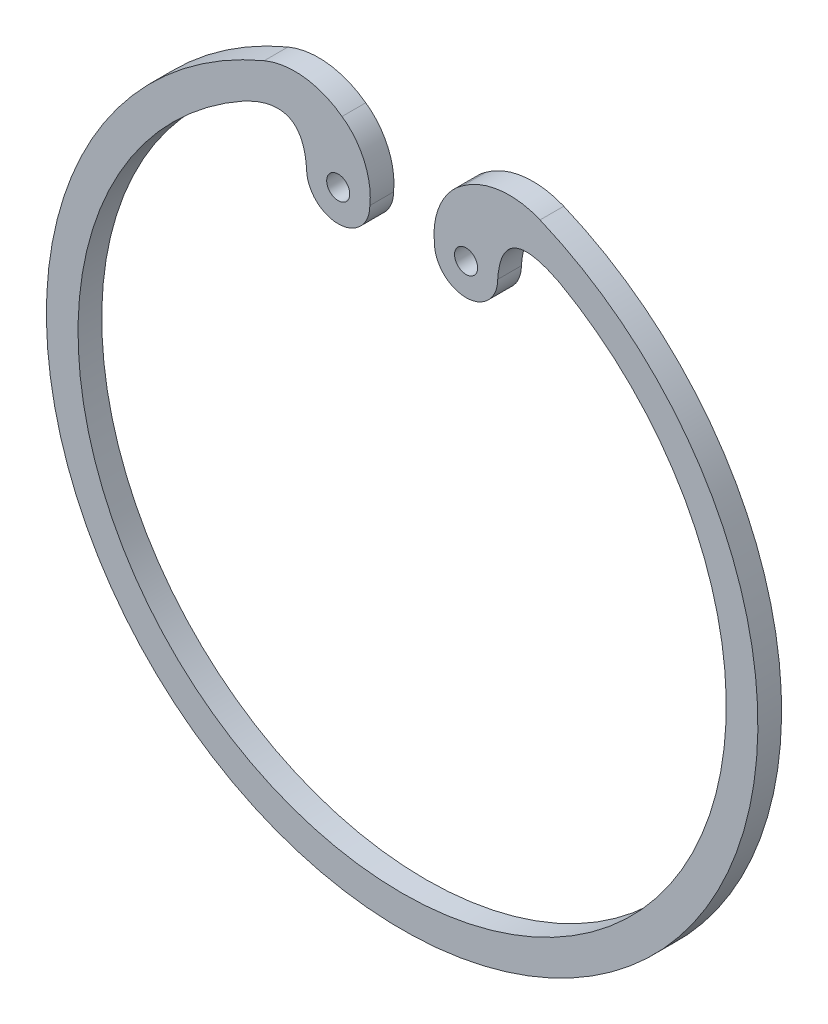
ISO-10303-21;
HEADER;
FILE_DESCRIPTION(('STEP AP214'),'2;1');
FILE_NAME('part.step','',(''),(''),'','','');
FILE_SCHEMA(('AUTOMOTIVE_DESIGN { 1 0 10303 214 1 1 1 1 }'));
ENDSEC;
DATA;
#1=APPLICATION_CONTEXT('core data for automotive mechanical design processes');
#2=APPLICATION_PROTOCOL_DEFINITION('international standard','automotive_design',2000,#1);
#3=PRODUCT_CONTEXT('',#1,'mechanical');
#4=PRODUCT('Part','Part','',(#3));
#5=PRODUCT_RELATED_PRODUCT_CATEGORY('part','',(#4));
#6=PRODUCT_DEFINITION_FORMATION('','',#4);
#7=PRODUCT_DEFINITION_CONTEXT('part definition',#1,'design');
#8=PRODUCT_DEFINITION('design','',#6,#7);
#9=PRODUCT_DEFINITION_SHAPE('','',#8);
#10=(LENGTH_UNIT() NAMED_UNIT(*) SI_UNIT(.MILLI.,.METRE.));
#11=(NAMED_UNIT(*) PLANE_ANGLE_UNIT() SI_UNIT($,.RADIAN.));
#12=(NAMED_UNIT(*) SI_UNIT($,.STERADIAN.) SOLID_ANGLE_UNIT());
#13=UNCERTAINTY_MEASURE_WITH_UNIT(LENGTH_MEASURE(1.E-05),#10,'distance_accuracy_value','');
#14=(GEOMETRIC_REPRESENTATION_CONTEXT(3) GLOBAL_UNCERTAINTY_ASSIGNED_CONTEXT((#13)) GLOBAL_UNIT_ASSIGNED_CONTEXT((#10,
#11,#12)) REPRESENTATION_CONTEXT('',''));
#15=CARTESIAN_POINT('',(0.,0.,0.));
#16=DIRECTION('',(0.,0.,1.));
#17=DIRECTION('',(1.,0.,0.));
#18=AXIS2_PLACEMENT_3D('',#15,#16,#17);
#19=CARTESIAN_POINT('',(0.,0.,3.));
#20=DIRECTION('',(0.,0.,1.));
#21=DIRECTION('',(1.,0.,0.));
#22=AXIS2_PLACEMENT_3D('',#19,#20,#21);
#23=PLANE('',#22);
#24=CARTESIAN_POINT('',(8.08641677086364,32.2850390508751,3.));
#25=DIRECTION('',(0.,0.,-1.));
#26=DIRECTION('',(-1.,0.,0.));
#27=AXIS2_PLACEMENT_3D('',#24,#25,#26);
#28=CIRCLE('',#27,1.45979372468937);
#29=CARTESIAN_POINT('',(6.62662304617427,32.2850390508751,3.));
#30=VERTEX_POINT('',#29);
#31=EDGE_CURVE('E346',#30,#30,#28,.T.);
#32=ORIENTED_EDGE('',*,*,#31,.T.);
#33=EDGE_LOOP('',(#32));
#34=FACE_BOUND('',#33,.T.);
#35=CARTESIAN_POINT('',(-8.08641677086364,32.2850390508751,3.));
#36=DIRECTION('',(0.,0.,1.));
#37=DIRECTION('',(1.,0.,0.));
#38=AXIS2_PLACEMENT_3D('',#35,#36,#37);
#39=CIRCLE('',#38,1.45979372468937);
#40=CARTESIAN_POINT('',(-6.62662304617427,32.2850390508751,3.));
#41=VERTEX_POINT('',#40);
#42=EDGE_CURVE('E221',#41,#41,#39,.T.);
#43=ORIENTED_EDGE('',*,*,#42,.F.);
#44=EDGE_LOOP('',(#43));
#45=FACE_BOUND('',#44,.T.);
#46=CARTESIAN_POINT('',(0.,0.,3.));
#47=DIRECTION('',(0.,0.,1.));
#48=DIRECTION('',(1.,0.,0.));
#49=AXIS2_PLACEMENT_3D('',#46,#47,#48);
#50=CIRCLE('',#49,45.);
#51=CARTESIAN_POINT('',(-17.4448135891502,41.4810616889179,3.));
#52=VERTEX_POINT('',#51);
#53=CARTESIAN_POINT('',(17.4448135891502,41.4810616889179,3.));
#54=VERTEX_POINT('',#53);
#55=EDGE_CURVE('E126',#52,#54,#50,.T.);
#56=ORIENTED_EDGE('',*,*,#55,.T.);
#57=CARTESIAN_POINT('',(13.5681883471168,32.2630479802695,3.));
#58=DIRECTION('',(0.,0.,1.));
#59=DIRECTION('',(1.,0.,0.));
#60=AXIS2_PLACEMENT_3D('',#57,#58,#59);
#61=CIRCLE('',#60,10.);
#62=CARTESIAN_POINT('',(7.60283683229724,40.2889174848551,3.));
#63=VERTEX_POINT('',#62);
#64=EDGE_CURVE('E54',#54,#63,#61,.T.);
#65=ORIENTED_EDGE('',*,*,#64,.T.);
#66=CARTESIAN_POINT('',(4.08641677086364,32.2850390508751,3.));
#67=CARTESIAN_POINT('',(3.77552911303632,34.9284671060197,3.));
#68=CARTESIAN_POINT('',(6.01321851688633,41.2063491480814,3.));
#69=CARTESIAN_POINT('',(12.6869936092536,42.3833529375417,3.));
#70=CARTESIAN_POINT('',(15.6688862679907,42.1839543324327,3.));
#71=B_SPLINE_CURVE_WITH_KNOTS('',3,(#66,#67,#68,#69,#70),.UNSPECIFIED.,.F.,.F.,(4,1,4),(0.,
0.461232636080991,1.),.UNSPECIFIED.);
#72=CARTESIAN_POINT('',(4.08641677086363,32.2850390508751,3.));
#73=VERTEX_POINT('',#72);
#74=EDGE_CURVE('E124',#73,#63,#71,.T.);
#75=ORIENTED_EDGE('',*,*,#74,.F.);
#76=CARTESIAN_POINT('',(8.08641677086364,32.2850390508751,3.));
#77=DIRECTION('',(0.,0.,-1.));
#78=DIRECTION('',(-1.,0.,0.));
#79=AXIS2_PLACEMENT_3D('',#76,#77,#78);
#80=CIRCLE('',#79,4.);
#81=CARTESIAN_POINT('',(12.0864167708636,32.2850390508751,3.));
#82=VERTEX_POINT('',#81);
#83=EDGE_CURVE('E135',#82,#73,#80,.T.);
#84=ORIENTED_EDGE('',*,*,#83,.F.);
#85=CARTESIAN_POINT('',(19.8836619065728,35.8558222494634,3.));
#86=CARTESIAN_POINT('',(12.5978527141027,39.5892887875731,3.));
#87=CARTESIAN_POINT('',(12.0864167708636,32.2850390508751,3.));
#88=B_SPLINE_CURVE_WITH_KNOTS('',2,(#85,#86,#87),.UNSPECIFIED.,.F.,.F.,(3,3),(0.,1.),.UNSPECIFIED.);
#89=CARTESIAN_POINT('',(19.8836619065728,35.8558222494634,3.));
#90=VERTEX_POINT('',#89);
#91=EDGE_CURVE('E136',#90,#82,#88,.T.);
#92=ORIENTED_EDGE('',*,*,#91,.F.);
#93=CARTESIAN_POINT('',(0.,0.,3.));
#94=DIRECTION('',(0.,0.,1.));
#95=DIRECTION('',(1.,0.,0.));
#96=AXIS2_PLACEMENT_3D('',#93,#94,#95);
#97=CIRCLE('',#96,41.);
#98=CARTESIAN_POINT('',(-19.8836619065728,35.8558222494634,3.));
#99=VERTEX_POINT('',#98);
#100=EDGE_CURVE('E152',#99,#90,#97,.T.);
#101=ORIENTED_EDGE('',*,*,#100,.F.);
#102=CARTESIAN_POINT('',(-19.8836619065728,35.8558222494634,3.));
#103=CARTESIAN_POINT('',(-12.5978527141027,39.5892887875731,3.));
#104=CARTESIAN_POINT('',(-12.0864167708636,32.2850390508751,3.));
#105=B_SPLINE_CURVE_WITH_KNOTS('',2,(#102,#103,#104),.UNSPECIFIED.,.F.,.F.,(3,3),(0.,1.),.UNSPECIFIED.);
#106=CARTESIAN_POINT('',(-12.0864167708636,32.2850390508751,3.));
#107=VERTEX_POINT('',#106);
#108=EDGE_CURVE('E179',#99,#107,#105,.T.);
#109=ORIENTED_EDGE('',*,*,#108,.T.);
#110=CARTESIAN_POINT('',(-8.08641677086364,32.2850390508751,3.));
#111=DIRECTION('',(0.,0.,1.));
#112=DIRECTION('',(1.,0.,0.));
#113=AXIS2_PLACEMENT_3D('',#110,#111,#112);
#114=CIRCLE('',#113,4.);
#115=CARTESIAN_POINT('',(-4.08641677086363,32.2850390508751,3.));
#116=VERTEX_POINT('',#115);
#117=EDGE_CURVE('E173',#107,#116,#114,.T.);
#118=ORIENTED_EDGE('',*,*,#117,.T.);
#119=CARTESIAN_POINT('',(-4.08641677086364,32.2850390508751,3.));
#120=CARTESIAN_POINT('',(-3.77552911303632,34.9284671060197,3.));
#121=CARTESIAN_POINT('',(-6.01321851688633,41.2063491480814,3.));
#122=CARTESIAN_POINT('',(-12.6869936092536,42.3833529375417,3.));
#123=CARTESIAN_POINT('',(-15.6688862679907,42.1839543324327,3.));
#124=B_SPLINE_CURVE_WITH_KNOTS('',3,(#119,#120,#121,#122,#123),.UNSPECIFIED.,.F.,.F.,(4,1,4),
(0.,0.461232636080991,1.),.UNSPECIFIED.);
#125=CARTESIAN_POINT('',(-7.60283683229725,40.2889174848551,3.));
#126=VERTEX_POINT('',#125);
#127=EDGE_CURVE('E167',#116,#126,#124,.T.);
#128=ORIENTED_EDGE('',*,*,#127,.T.);
#129=CARTESIAN_POINT('',(-13.5681883471168,32.2630479802695,3.));
#130=DIRECTION('',(0.,0.,1.));
#131=DIRECTION('',(1.,0.,0.));
#132=AXIS2_PLACEMENT_3D('',#129,#130,#131);
#133=CIRCLE('',#132,10.);
#134=EDGE_CURVE('E145',#126,#52,#133,.T.);
#135=ORIENTED_EDGE('',*,*,#134,.T.);
#136=EDGE_LOOP('',(#56,#65,#75,#84,#92,#101,#109,#118,#128,#135));
#137=FACE_BOUND('',#136,.T.);
#138=ADVANCED_FACE('F46',(#34,#45,#137),#23,.T.);
#139=CARTESIAN_POINT('',(0.,0.,0.));
#140=DIRECTION('',(0.,0.,1.));
#141=DIRECTION('',(1.,0.,0.));
#142=AXIS2_PLACEMENT_3D('',#139,#140,#141);
#143=PLANE('',#142);
#144=CARTESIAN_POINT('',(-8.08641677086364,32.2850390508751,0.));
#145=DIRECTION('',(0.,0.,1.));
#146=DIRECTION('',(1.,0.,0.));
#147=AXIS2_PLACEMENT_3D('',#144,#145,#146);
#148=CIRCLE('',#147,1.45979372468937);
#149=CARTESIAN_POINT('',(-6.62662304617427,32.2850390508751,0.));
#150=VERTEX_POINT('',#149);
#151=EDGE_CURVE('E184',#150,#150,#148,.T.);
#152=ORIENTED_EDGE('',*,*,#151,.T.);
#153=EDGE_LOOP('',(#152));
#154=FACE_BOUND('',#153,.T.);
#155=CARTESIAN_POINT('',(8.08641677086364,32.2850390508751,0.));
#156=DIRECTION('',(0.,0.,-1.));
#157=DIRECTION('',(-1.,0.,0.));
#158=AXIS2_PLACEMENT_3D('',#155,#156,#157);
#159=CIRCLE('',#158,1.45979372468937);
#160=CARTESIAN_POINT('',(6.62662304617427,32.2850390508751,0.));
#161=VERTEX_POINT('',#160);
#162=EDGE_CURVE('E247',#161,#161,#159,.T.);
#163=ORIENTED_EDGE('',*,*,#162,.F.);
#164=EDGE_LOOP('',(#163));
#165=FACE_BOUND('',#164,.T.);
#166=CARTESIAN_POINT('',(4.08641677086364,32.2850390508751,0.));
#167=CARTESIAN_POINT('',(3.77552911303632,34.9284671060197,0.));
#168=CARTESIAN_POINT('',(6.01321851688633,41.2063491480814,0.));
#169=CARTESIAN_POINT('',(12.6869936092536,42.3833529375417,0.));
#170=CARTESIAN_POINT('',(15.6688862679907,42.1839543324327,0.));
#171=B_SPLINE_CURVE_WITH_KNOTS('',3,(#166,#167,#168,#169,#170),.UNSPECIFIED.,.F.,.F.,(4,1,4),
(0.,0.461232636080991,1.),.UNSPECIFIED.);
#172=CARTESIAN_POINT('',(4.08641677086363,32.2850390508751,0.));
#173=VERTEX_POINT('',#172);
#174=CARTESIAN_POINT('',(7.60283683229759,40.2889174848553,0.));
#175=VERTEX_POINT('',#174);
#176=EDGE_CURVE('E252',#173,#175,#171,.T.);
#177=ORIENTED_EDGE('',*,*,#176,.T.);
#178=CARTESIAN_POINT('',(13.5681883471168,32.2630479802695,0.));
#179=DIRECTION('',(0.,0.,1.));
#180=DIRECTION('',(1.,0.,0.));
#181=AXIS2_PLACEMENT_3D('',#178,#179,#180);
#182=CIRCLE('',#181,10.);
#183=CARTESIAN_POINT('',(17.4448135891502,41.4810616889179,0.));
#184=VERTEX_POINT('',#183);
#185=EDGE_CURVE('E13',#175,#184,#182,.F.);
#186=ORIENTED_EDGE('',*,*,#185,.T.);
#187=CARTESIAN_POINT('',(0.,0.,0.));
#188=DIRECTION('',(0.,0.,1.));
#189=DIRECTION('',(1.,0.,0.));
#190=AXIS2_PLACEMENT_3D('',#187,#188,#189);
#191=CIRCLE('',#190,45.);
#192=CARTESIAN_POINT('',(-17.4448135891502,41.4810616889179,0.));
#193=VERTEX_POINT('',#192);
#194=EDGE_CURVE('E150',#193,#184,#191,.T.);
#195=ORIENTED_EDGE('',*,*,#194,.F.);
#196=CARTESIAN_POINT('',(-13.5681883471168,32.2630479802695,0.));
#197=DIRECTION('',(0.,0.,1.));
#198=DIRECTION('',(1.,0.,0.));
#199=AXIS2_PLACEMENT_3D('',#196,#197,#198);
#200=CIRCLE('',#199,10.);
#201=CARTESIAN_POINT('',(-7.60283683229724,40.2889174848551,0.));
#202=VERTEX_POINT('',#201);
#203=EDGE_CURVE('E138',#193,#202,#200,.F.);
#204=ORIENTED_EDGE('',*,*,#203,.T.);
#205=CARTESIAN_POINT('',(-4.08641677086364,32.2850390508751,0.));
#206=CARTESIAN_POINT('',(-3.77552911303632,34.9284671060197,0.));
#207=CARTESIAN_POINT('',(-6.01321851688633,41.2063491480814,0.));
#208=CARTESIAN_POINT('',(-12.6869936092536,42.3833529375417,0.));
#209=CARTESIAN_POINT('',(-15.6688862679907,42.1839543324327,0.));
#210=B_SPLINE_CURVE_WITH_KNOTS('',3,(#205,#206,#207,#208,#209),.UNSPECIFIED.,.F.,.F.,(4,1,4),
(0.,0.461232636080991,1.),.UNSPECIFIED.);
#211=CARTESIAN_POINT('',(-4.08641677086363,32.2850390508751,0.));
#212=VERTEX_POINT('',#211);
#213=EDGE_CURVE('E163',#212,#202,#210,.T.);
#214=ORIENTED_EDGE('',*,*,#213,.F.);
#215=CARTESIAN_POINT('',(-8.08641677086364,32.2850390508751,0.));
#216=DIRECTION('',(0.,0.,1.));
#217=DIRECTION('',(1.,0.,0.));
#218=AXIS2_PLACEMENT_3D('',#215,#216,#217);
#219=CIRCLE('',#218,4.);
#220=CARTESIAN_POINT('',(-12.0864167708636,32.2850390508751,0.));
#221=VERTEX_POINT('',#220);
#222=EDGE_CURVE('E193',#221,#212,#219,.T.);
#223=ORIENTED_EDGE('',*,*,#222,.F.);
#224=CARTESIAN_POINT('',(-19.8836619065728,35.8558222494634,0.));
#225=CARTESIAN_POINT('',(-12.5978527141027,39.5892887875731,0.));
#226=CARTESIAN_POINT('',(-12.0864167708636,32.2850390508751,0.));
#227=B_SPLINE_CURVE_WITH_KNOTS('',2,(#224,#225,#226),.UNSPECIFIED.,.F.,.F.,(3,3),(0.,1.),.UNSPECIFIED.);
#228=CARTESIAN_POINT('',(-19.8836619065728,35.8558222494634,0.));
#229=VERTEX_POINT('',#228);
#230=EDGE_CURVE('E172',#229,#221,#227,.T.);
#231=ORIENTED_EDGE('',*,*,#230,.F.);
#232=CARTESIAN_POINT('',(0.,0.,0.));
#233=DIRECTION('',(0.,0.,1.));
#234=DIRECTION('',(1.,0.,0.));
#235=AXIS2_PLACEMENT_3D('',#232,#233,#234);
#236=CIRCLE('',#235,41.);
#237=CARTESIAN_POINT('',(19.8836619065728,35.8558222494634,0.));
#238=VERTEX_POINT('',#237);
#239=EDGE_CURVE('E154',#229,#238,#236,.T.);
#240=ORIENTED_EDGE('',*,*,#239,.T.);
#241=CARTESIAN_POINT('',(19.8836619065728,35.8558222494634,0.));
#242=CARTESIAN_POINT('',(12.5978527141027,39.5892887875731,0.));
#243=CARTESIAN_POINT('',(12.0864167708636,32.2850390508751,0.));
#244=B_SPLINE_CURVE_WITH_KNOTS('',2,(#241,#242,#243),.UNSPECIFIED.,.F.,.F.,(3,3),(0.,1.),.UNSPECIFIED.);
#245=CARTESIAN_POINT('',(12.0864167708636,32.2850390508751,0.));
#246=VERTEX_POINT('',#245);
#247=EDGE_CURVE('E236',#238,#246,#244,.T.);
#248=ORIENTED_EDGE('',*,*,#247,.T.);
#249=CARTESIAN_POINT('',(8.08641677086364,32.2850390508751,0.));
#250=DIRECTION('',(0.,0.,-1.));
#251=DIRECTION('',(-1.,0.,0.));
#252=AXIS2_PLACEMENT_3D('',#249,#250,#251);
#253=CIRCLE('',#252,4.);
#254=EDGE_CURVE('E232',#246,#173,#253,.T.);
#255=ORIENTED_EDGE('',*,*,#254,.T.);
#256=EDGE_LOOP('',(#177,#186,#195,#204,#214,#223,#231,#240,#248,#255));
#257=FACE_BOUND('',#256,.T.);
#258=ADVANCED_FACE('F281',(#154,#165,#257),#143,.F.);
#259=CARTESIAN_POINT('',(0.,0.,3.));
#260=DIRECTION('',(0.,0.,-1.));
#261=DIRECTION('',(-1.,0.,0.));
#262=AXIS2_PLACEMENT_3D('',#259,#260,#261);
#263=CYLINDRICAL_SURFACE('',#262,45.);
#264=ORIENTED_EDGE('',*,*,#194,.T.);
#265=DIRECTION('',(0.,0.,-1.));
#266=VECTOR('',#265,1.);
#267=CARTESIAN_POINT('',(17.4448135891502,41.4810616889179,3.));
#268=LINE('',#267,#266);
#269=EDGE_CURVE('E127',#184,#54,#268,.F.);
#270=ORIENTED_EDGE('',*,*,#269,.T.);
#271=ORIENTED_EDGE('',*,*,#55,.F.);
#272=DIRECTION('',(0.,0.,-1.));
#273=VECTOR('',#272,1.);
#274=CARTESIAN_POINT('',(-17.4448135891502,41.4810616889179,3.));
#275=LINE('',#274,#273);
#276=EDGE_CURVE('E141',#52,#193,#275,.T.);
#277=ORIENTED_EDGE('',*,*,#276,.T.);
#278=EDGE_LOOP('',(#264,#270,#271,#277));
#279=FACE_BOUND('',#278,.T.);
#280=ADVANCED_FACE('F286',(#279),#263,.T.);
#281=CARTESIAN_POINT('',(0.,0.,3.));
#282=DIRECTION('',(0.,0.,-1.));
#283=DIRECTION('',(-1.,0.,0.));
#284=AXIS2_PLACEMENT_3D('',#281,#282,#283);
#285=CYLINDRICAL_SURFACE('',#284,41.);
#286=ORIENTED_EDGE('',*,*,#100,.T.);
#287=DIRECTION('',(0.,0.,1.));
#288=VECTOR('',#287,1.);
#289=CARTESIAN_POINT('',(19.8836619065728,35.8558222494634,0.));
#290=LINE('',#289,#288);
#291=EDGE_CURVE('E230',#238,#90,#290,.T.);
#292=ORIENTED_EDGE('',*,*,#291,.F.);
#293=ORIENTED_EDGE('',*,*,#239,.F.);
#294=DIRECTION('',(0.,0.,1.));
#295=VECTOR('',#294,1.);
#296=CARTESIAN_POINT('',(-19.8836619065728,35.8558222494634,0.));
#297=LINE('',#296,#295);
#298=EDGE_CURVE('E157',#229,#99,#297,.T.);
#299=ORIENTED_EDGE('',*,*,#298,.T.);
#300=EDGE_LOOP('',(#286,#292,#293,#299));
#301=FACE_BOUND('',#300,.T.);
#302=ADVANCED_FACE('F213',(#301),#285,.F.);
#303=DIRECTION('',(0.,0.,1.));
#304=VECTOR('',#303,1.);
#305=SURFACE_OF_LINEAR_EXTRUSION('',#227,#304);
#306=ORIENTED_EDGE('',*,*,#108,.F.);
#307=ORIENTED_EDGE('',*,*,#298,.F.);
#308=ORIENTED_EDGE('',*,*,#230,.T.);
#309=DIRECTION('',(0.,0.,1.));
#310=VECTOR('',#309,1.);
#311=CARTESIAN_POINT('',(-12.0864167708636,32.2850390508751,0.));
#312=LINE('',#311,#310);
#313=EDGE_CURVE('E160',#221,#107,#312,.T.);
#314=ORIENTED_EDGE('',*,*,#313,.T.);
#315=EDGE_LOOP('',(#306,#307,#308,#314));
#316=FACE_BOUND('',#315,.T.);
#317=ADVANCED_FACE('F204',(#316),#305,.T.);
#318=DIRECTION('',(0.,0.,1.));
#319=VECTOR('',#318,1.);
#320=SURFACE_OF_LINEAR_EXTRUSION('',#210,#319);
#321=ORIENTED_EDGE('',*,*,#213,.T.);
#322=DIRECTION('',(0.,0.,1.));
#323=VECTOR('',#322,1.);
#324=CARTESIAN_POINT('',(-7.60283683229726,40.2889174848551,0.));
#325=LINE('',#324,#323);
#326=EDGE_CURVE('E147',#202,#126,#325,.T.);
#327=ORIENTED_EDGE('',*,*,#326,.T.);
#328=ORIENTED_EDGE('',*,*,#127,.F.);
#329=DIRECTION('',(0.,0.,1.));
#330=VECTOR('',#329,1.);
#331=CARTESIAN_POINT('',(-4.08641677086363,32.2850390508751,0.));
#332=LINE('',#331,#330);
#333=EDGE_CURVE('E162',#212,#116,#332,.T.);
#334=ORIENTED_EDGE('',*,*,#333,.F.);
#335=EDGE_LOOP('',(#321,#327,#328,#334));
#336=FACE_BOUND('',#335,.T.);
#337=ADVANCED_FACE('F199',(#336),#320,.T.);
#338=CARTESIAN_POINT('',(-8.08641677086364,32.2850390508751,0.));
#339=DIRECTION('',(0.,0.,1.));
#340=DIRECTION('',(1.,0.,0.));
#341=AXIS2_PLACEMENT_3D('',#338,#339,#340);
#342=CYLINDRICAL_SURFACE('',#341,4.);
#343=ORIENTED_EDGE('',*,*,#117,.F.);
#344=ORIENTED_EDGE('',*,*,#313,.F.);
#345=ORIENTED_EDGE('',*,*,#222,.T.);
#346=ORIENTED_EDGE('',*,*,#333,.T.);
#347=EDGE_LOOP('',(#343,#344,#345,#346));
#348=FACE_BOUND('',#347,.T.);
#349=ADVANCED_FACE('F203',(#348),#342,.T.);
#350=CARTESIAN_POINT('',(-8.08641677086364,32.2850390508751,0.));
#351=DIRECTION('',(0.,0.,1.));
#352=DIRECTION('',(1.,0.,0.));
#353=AXIS2_PLACEMENT_3D('',#350,#351,#352);
#354=CYLINDRICAL_SURFACE('',#353,1.45979372468937);
#355=ORIENTED_EDGE('',*,*,#151,.F.);
#356=EDGE_LOOP('',(#355));
#357=FACE_BOUND('',#356,.T.);
#358=ORIENTED_EDGE('',*,*,#42,.T.);
#359=EDGE_LOOP('',(#358));
#360=FACE_BOUND('',#359,.T.);
#361=ADVANCED_FACE('F206',(#357,#360),#354,.F.);
#362=CARTESIAN_POINT('',(-13.5681883471168,32.2630479802695,3.));
#363=DIRECTION('',(0.,0.,-1.));
#364=DIRECTION('',(-1.,0.,0.));
#365=AXIS2_PLACEMENT_3D('',#362,#363,#364);
#366=CYLINDRICAL_SURFACE('',#365,10.);
#367=ORIENTED_EDGE('',*,*,#203,.F.);
#368=ORIENTED_EDGE('',*,*,#276,.F.);
#369=ORIENTED_EDGE('',*,*,#134,.F.);
#370=ORIENTED_EDGE('',*,*,#326,.F.);
#371=EDGE_LOOP('',(#367,#368,#369,#370));
#372=FACE_BOUND('',#371,.T.);
#373=ADVANCED_FACE('F272',(#372),#366,.T.);
#374=DIRECTION('',(0.,0.,1.));
#375=VECTOR('',#374,1.);
#376=SURFACE_OF_LINEAR_EXTRUSION('',#244,#375);
#377=ORIENTED_EDGE('',*,*,#91,.T.);
#378=DIRECTION('',(0.,0.,1.));
#379=VECTOR('',#378,1.);
#380=CARTESIAN_POINT('',(12.0864167708636,32.2850390508751,0.));
#381=LINE('',#380,#379);
#382=EDGE_CURVE('E227',#246,#82,#381,.T.);
#383=ORIENTED_EDGE('',*,*,#382,.F.);
#384=ORIENTED_EDGE('',*,*,#247,.F.);
#385=ORIENTED_EDGE('',*,*,#291,.T.);
#386=EDGE_LOOP('',(#377,#383,#384,#385));
#387=FACE_BOUND('',#386,.T.);
#388=ADVANCED_FACE('F270',(#387),#376,.F.);
#389=CARTESIAN_POINT('',(8.08641677086364,32.2850390508751,0.));
#390=DIRECTION('',(0.,0.,1.));
#391=DIRECTION('',(1.,0.,0.));
#392=AXIS2_PLACEMENT_3D('',#389,#390,#391);
#393=CYLINDRICAL_SURFACE('',#392,4.);
#394=ORIENTED_EDGE('',*,*,#83,.T.);
#395=DIRECTION('',(0.,0.,1.));
#396=VECTOR('',#395,1.);
#397=CARTESIAN_POINT('',(4.08641677086363,32.2850390508751,0.));
#398=LINE('',#397,#396);
#399=EDGE_CURVE('E134',#173,#73,#398,.T.);
#400=ORIENTED_EDGE('',*,*,#399,.F.);
#401=ORIENTED_EDGE('',*,*,#254,.F.);
#402=ORIENTED_EDGE('',*,*,#382,.T.);
#403=EDGE_LOOP('',(#394,#400,#401,#402));
#404=FACE_BOUND('',#403,.T.);
#405=ADVANCED_FACE('F268',(#404),#393,.T.);
#406=DIRECTION('',(0.,0.,1.));
#407=VECTOR('',#406,1.);
#408=SURFACE_OF_LINEAR_EXTRUSION('',#171,#407);
#409=DIRECTION('',(0.,0.,1.));
#410=VECTOR('',#409,1.);
#411=CARTESIAN_POINT('',(7.60283683229726,40.2889174848551,0.));
#412=LINE('',#411,#410);
#413=EDGE_CURVE('E132',#175,#63,#412,.T.);
#414=ORIENTED_EDGE('',*,*,#413,.F.);
#415=ORIENTED_EDGE('',*,*,#176,.F.);
#416=ORIENTED_EDGE('',*,*,#399,.T.);
#417=ORIENTED_EDGE('',*,*,#74,.T.);
#418=EDGE_LOOP('',(#414,#415,#416,#417));
#419=FACE_BOUND('',#418,.T.);
#420=ADVANCED_FACE('F130',(#419),#408,.F.);
#421=CARTESIAN_POINT('',(8.08641677086364,32.2850390508751,0.));
#422=DIRECTION('',(0.,0.,1.));
#423=DIRECTION('',(1.,0.,0.));
#424=AXIS2_PLACEMENT_3D('',#421,#422,#423);
#425=CYLINDRICAL_SURFACE('',#424,1.45979372468937);
#426=ORIENTED_EDGE('',*,*,#162,.T.);
#427=EDGE_LOOP('',(#426));
#428=FACE_BOUND('',#427,.T.);
#429=ORIENTED_EDGE('',*,*,#31,.F.);
#430=EDGE_LOOP('',(#429));
#431=FACE_BOUND('',#430,.T.);
#432=ADVANCED_FACE('F267',(#428,#431),#425,.F.);
#433=CARTESIAN_POINT('',(13.5681883471168,32.2630479802695,1.5));
#434=DIRECTION('',(0.,0.,-1.));
#435=DIRECTION('',(-1.,0.,0.));
#436=AXIS2_PLACEMENT_3D('',#433,#434,#435);
#437=CYLINDRICAL_SURFACE('',#436,10.);
#438=ORIENTED_EDGE('',*,*,#185,.F.);
#439=ORIENTED_EDGE('',*,*,#413,.T.);
#440=ORIENTED_EDGE('',*,*,#64,.F.);
#441=ORIENTED_EDGE('',*,*,#269,.F.);
#442=EDGE_LOOP('',(#438,#439,#440,#441));
#443=FACE_BOUND('',#442,.T.);
#444=ADVANCED_FACE('F48',(#443),#437,.T.);
#445=CLOSED_SHELL('',(#138,#258,#280,#302,#317,#337,#349,#361,#373,#388,#405,#420,#432,#444));
#446=MANIFOLD_SOLID_BREP('B2',#445);
#447=ADVANCED_BREP_SHAPE_REPRESENTATION('',(#18,#446),#14);
#448=SHAPE_DEFINITION_REPRESENTATION(#9,#447);
ENDSEC;
END-ISO-10303-21;
